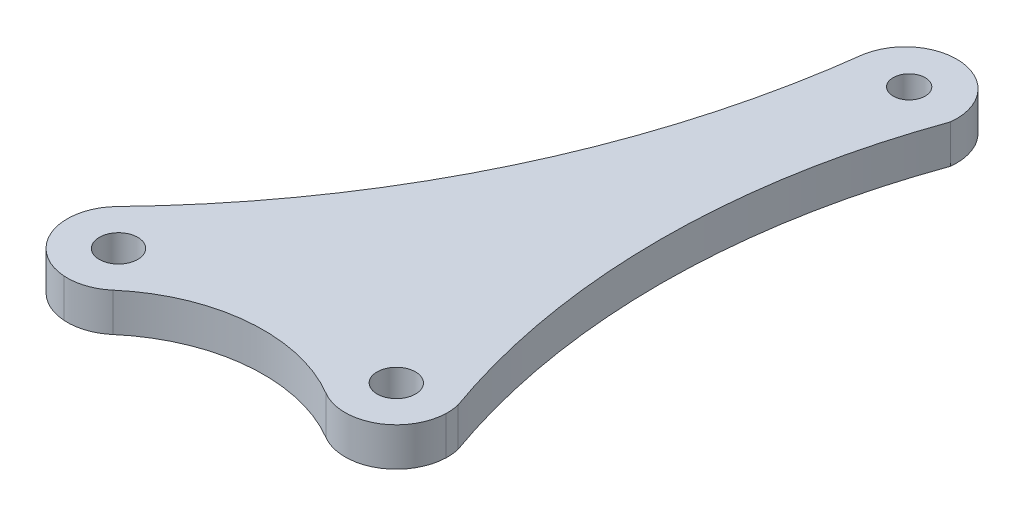
ISO-10303-21;
HEADER;
FILE_DESCRIPTION(('STEP AP214'),'2;1');
FILE_NAME('part.step','',(''),(''),'','','');
FILE_SCHEMA(('AUTOMOTIVE_DESIGN { 1 0 10303 214 1 1 1 1 }'));
ENDSEC;
DATA;
#1=APPLICATION_CONTEXT('core data for automotive mechanical design processes');
#2=APPLICATION_PROTOCOL_DEFINITION('international standard','automotive_design',2000,#1);
#3=PRODUCT_CONTEXT('',#1,'mechanical');
#4=PRODUCT('Part','Part','',(#3));
#5=PRODUCT_RELATED_PRODUCT_CATEGORY('part','',(#4));
#6=PRODUCT_DEFINITION_FORMATION('','',#4);
#7=PRODUCT_DEFINITION_CONTEXT('part definition',#1,'design');
#8=PRODUCT_DEFINITION('design','',#6,#7);
#9=PRODUCT_DEFINITION_SHAPE('','',#8);
#10=(LENGTH_UNIT() NAMED_UNIT(*) SI_UNIT(.MILLI.,.METRE.));
#11=(NAMED_UNIT(*) PLANE_ANGLE_UNIT() SI_UNIT($,.RADIAN.));
#12=(NAMED_UNIT(*) SI_UNIT($,.STERADIAN.) SOLID_ANGLE_UNIT());
#13=UNCERTAINTY_MEASURE_WITH_UNIT(LENGTH_MEASURE(1.E-05),#10,'distance_accuracy_value','');
#14=(GEOMETRIC_REPRESENTATION_CONTEXT(3) GLOBAL_UNCERTAINTY_ASSIGNED_CONTEXT((#13)) GLOBAL_UNIT_ASSIGNED_CONTEXT((#10,
#11,#12)) REPRESENTATION_CONTEXT('',''));
#15=CARTESIAN_POINT('',(0.,0.,0.));
#16=DIRECTION('',(0.,0.,1.));
#17=DIRECTION('',(1.,0.,0.));
#18=AXIS2_PLACEMENT_3D('',#15,#16,#17);
#19=CARTESIAN_POINT('',(27.9997395925462,3.,-100.003328656912));
#20=DIRECTION('',(0.,1.,0.));
#21=DIRECTION('',(0.,0.,1.));
#22=AXIS2_PLACEMENT_3D('',#19,#20,#21);
#23=PLANE('',#22);
#24=CARTESIAN_POINT('',(27.9995484159629,3.,-100.00220000214));
#25=DIRECTION('',(0.,1.,0.));
#26=DIRECTION('',(0.,0.,1.));
#27=AXIS2_PLACEMENT_3D('',#24,#25,#26);
#28=CIRCLE('',#27,1.5);
#29=CARTESIAN_POINT('',(27.9995484159629,3.,-98.5022000021398));
#30=VERTEX_POINT('',#29);
#31=EDGE_CURVE('E181',#30,#30,#28,.T.);
#32=ORIENTED_EDGE('',*,*,#31,.F.);
#33=EDGE_LOOP('',(#32));
#34=FACE_BOUND('',#33,.T.);
#35=CARTESIAN_POINT('',(27.9999307691296,3.,-100.004457311684));
#36=DIRECTION('',(0.,1.,0.));
#37=DIRECTION('',(0.,0.,1.));
#38=AXIS2_PLACEMENT_3D('',#35,#36,#37);
#39=CIRCLE('',#38,4.00207966259629);
#40=CARTESIAN_POINT('',(25.9594409642448,3.,-96.5616324567239));
#41=VERTEX_POINT('',#40);
#42=CARTESIAN_POINT('',(32.000304550885,3.,-99.8876188248278));
#43=VERTEX_POINT('',#42);
#44=EDGE_CURVE('E144',#41,#43,#39,.T.);
#45=ORIENTED_EDGE('',*,*,#44,.T.);
#46=CARTESIAN_POINT('',(27.9995484159629,3.,-100.00220000214));
#47=DIRECTION('',(0.,1.,0.));
#48=DIRECTION('',(0.,0.,1.));
#49=AXIS2_PLACEMENT_3D('',#46,#47,#48);
#50=CIRCLE('',#49,4.00239659420592);
#51=CARTESIAN_POINT('',(31.8998593501814,3.,-100.900394365141));
#52=VERTEX_POINT('',#51);
#53=EDGE_CURVE('E92',#43,#52,#50,.T.);
#54=ORIENTED_EDGE('',*,*,#53,.T.);
#55=CARTESIAN_POINT('',(85.362032945457,3.,-119.967387334482));
#56=DIRECTION('',(0.,-1.,0.));
#57=DIRECTION('',(0.,0.,1.));
#58=AXIS2_PLACEMENT_3D('',#55,#56,#57);
#59=CIRCLE('',#58,56.7604988211369);
#60=CARTESIAN_POINT('',(31.9728070759718,3.,-139.2376957773));
#61=VERTEX_POINT('',#60);
#62=EDGE_CURVE('E159',#52,#61,#59,.T.);
#63=ORIENTED_EDGE('',*,*,#62,.T.);
#64=CARTESIAN_POINT('',(27.976753798876,3.,-139.709113533065));
#65=DIRECTION('',(0.,1.,0.));
#66=DIRECTION('',(0.,0.,1.));
#67=AXIS2_PLACEMENT_3D('',#64,#65,#66);
#68=CIRCLE('',#67,4.02376397094048);
#69=CARTESIAN_POINT('',(24.0296582334114,3.,-140.490850759331));
#70=VERTEX_POINT('',#69);
#71=EDGE_CURVE('E172',#61,#70,#68,.T.);
#72=ORIENTED_EDGE('',*,*,#71,.T.);
#73=CARTESIAN_POINT('',(-44.3435391340725,3.,-148.905424388532));
#74=DIRECTION('',(0.,-1.,0.));
#75=DIRECTION('',(0.,0.,1.));
#76=AXIS2_PLACEMENT_3D('',#73,#74,#75);
#77=CIRCLE('',#76,68.8890351769726);
#78=CARTESIAN_POINT('',(5.19929151411349,3.,-101.038869269333));
#79=VERTEX_POINT('',#78);
#80=EDGE_CURVE('E111',#70,#79,#77,.T.);
#81=ORIENTED_EDGE('',*,*,#80,.T.);
#82=CARTESIAN_POINT('',(8.07557004138567,3.,-98.2591810851337));
#83=DIRECTION('',(0.,1.,0.));
#84=DIRECTION('',(0.,0.,1.));
#85=AXIS2_PLACEMENT_3D('',#82,#83,#84);
#86=CIRCLE('',#85,3.99995557073113);
#87=CARTESIAN_POINT('',(7.82466408204698,3.,-94.2671025829758));
#88=VERTEX_POINT('',#87);
#89=EDGE_CURVE('E105',#79,#88,#86,.T.);
#90=ORIENTED_EDGE('',*,*,#89,.T.);
#91=CARTESIAN_POINT('',(8.07563789305204,3.,-98.2592435633386));
#92=DIRECTION('',(0.,1.,0.));
#93=DIRECTION('',(0.,0.,1.));
#94=AXIS2_PLACEMENT_3D('',#91,#92,#93);
#95=CIRCLE('',#94,4.00002218255128);
#96=CARTESIAN_POINT('',(10.6820969431933,3.,-95.2250140596855));
#97=VERTEX_POINT('',#96);
#98=EDGE_CURVE('E109',#88,#97,#95,.T.);
#99=ORIENTED_EDGE('',*,*,#98,.T.);
#100=CARTESIAN_POINT('',(19.2520313653719,3.,-85.2491362051027));
#101=DIRECTION('',(0.,-1.,0.));
#102=DIRECTION('',(0.,0.,1.));
#103=AXIS2_PLACEMENT_3D('',#100,#101,#102);
#104=CIRCLE('',#103,13.1514985826709);
#105=EDGE_CURVE('E49',#97,#41,#104,.T.);
#106=ORIENTED_EDGE('',*,*,#105,.T.);
#107=EDGE_LOOP('',(#45,#54,#63,#72,#81,#90,#99,#106));
#108=FACE_BOUND('',#107,.T.);
#109=CARTESIAN_POINT('',(8.07561116786087,3.,-98.2592968022569));
#110=DIRECTION('',(0.,1.,0.));
#111=DIRECTION('',(0.,0.,1.));
#112=AXIS2_PLACEMENT_3D('',#109,#110,#111);
#113=CIRCLE('',#112,1.5);
#114=CARTESIAN_POINT('',(8.07561116786087,3.,-96.7592968022569));
#115=VERTEX_POINT('',#114);
#116=EDGE_CURVE('E133',#115,#115,#113,.T.);
#117=ORIENTED_EDGE('',*,*,#116,.F.);
#118=EDGE_LOOP('',(#117));
#119=FACE_BOUND('',#118,.T.);
#120=CARTESIAN_POINT('',(27.9996711600126,3.,-140.00224351471));
#121=DIRECTION('',(0.,1.,0.));
#122=DIRECTION('',(0.,0.,1.));
#123=AXIS2_PLACEMENT_3D('',#120,#121,#122);
#124=CIRCLE('',#123,1.25);
#125=CARTESIAN_POINT('',(27.9996711600126,3.,-138.75224351471));
#126=VERTEX_POINT('',#125);
#127=EDGE_CURVE('E187',#126,#126,#124,.T.);
#128=ORIENTED_EDGE('',*,*,#127,.F.);
#129=EDGE_LOOP('',(#128));
#130=FACE_BOUND('',#129,.T.);
#131=ADVANCED_FACE('F32',(#34,#108,#119,#130),#23,.T.);
#132=CARTESIAN_POINT('',(27.9997395925462,0.,-100.003328656912));
#133=DIRECTION('',(0.,1.,0.));
#134=DIRECTION('',(0.,0.,1.));
#135=AXIS2_PLACEMENT_3D('',#132,#133,#134);
#136=PLANE('',#135);
#137=CARTESIAN_POINT('',(27.9999307691296,0.,-100.004457311684));
#138=DIRECTION('',(0.,1.,0.));
#139=DIRECTION('',(0.,0.,1.));
#140=AXIS2_PLACEMENT_3D('',#137,#138,#139);
#141=CIRCLE('',#140,4.00207966259629);
#142=CARTESIAN_POINT('',(25.9594409642448,0.,-96.5616324567239));
#143=VERTEX_POINT('',#142);
#144=CARTESIAN_POINT('',(32.000304550885,0.,-99.8876188248278));
#145=VERTEX_POINT('',#144);
#146=EDGE_CURVE('E129',#143,#145,#141,.T.);
#147=ORIENTED_EDGE('',*,*,#146,.F.);
#148=CARTESIAN_POINT('',(19.2520313653719,0.,-85.2491362051027));
#149=DIRECTION('',(0.,-1.,0.));
#150=DIRECTION('',(0.,0.,1.));
#151=AXIS2_PLACEMENT_3D('',#148,#149,#150);
#152=CIRCLE('',#151,13.1514985826709);
#153=CARTESIAN_POINT('',(10.6820969431933,0.,-95.2250140596855));
#154=VERTEX_POINT('',#153);
#155=EDGE_CURVE('E84',#154,#143,#152,.T.);
#156=ORIENTED_EDGE('',*,*,#155,.F.);
#157=CARTESIAN_POINT('',(8.07563789305204,0.,-98.2592435633386));
#158=DIRECTION('',(0.,1.,0.));
#159=DIRECTION('',(0.,0.,1.));
#160=AXIS2_PLACEMENT_3D('',#157,#158,#159);
#161=CIRCLE('',#160,4.00002218255128);
#162=CARTESIAN_POINT('',(7.82466408204698,0.,-94.2671025829758));
#163=VERTEX_POINT('',#162);
#164=EDGE_CURVE('E78',#163,#154,#161,.T.);
#165=ORIENTED_EDGE('',*,*,#164,.F.);
#166=CARTESIAN_POINT('',(8.07557004138567,0.,-98.2591810851337));
#167=DIRECTION('',(0.,1.,0.));
#168=DIRECTION('',(0.,0.,1.));
#169=AXIS2_PLACEMENT_3D('',#166,#167,#168);
#170=CIRCLE('',#169,3.99995557073113);
#171=CARTESIAN_POINT('',(5.19929151411349,0.,-101.038869269333));
#172=VERTEX_POINT('',#171);
#173=EDGE_CURVE('E119',#172,#163,#170,.T.);
#174=ORIENTED_EDGE('',*,*,#173,.F.);
#175=CARTESIAN_POINT('',(-44.3435391340725,0.,-148.905424388532));
#176=DIRECTION('',(0.,-1.,0.));
#177=DIRECTION('',(0.,0.,1.));
#178=AXIS2_PLACEMENT_3D('',#175,#176,#177);
#179=CIRCLE('',#178,68.8890351769726);
#180=CARTESIAN_POINT('',(24.0296582334114,0.,-140.490850759331));
#181=VERTEX_POINT('',#180);
#182=EDGE_CURVE('E139',#181,#172,#179,.T.);
#183=ORIENTED_EDGE('',*,*,#182,.F.);
#184=CARTESIAN_POINT('',(27.976753798876,0.,-139.709113533065));
#185=DIRECTION('',(0.,1.,0.));
#186=DIRECTION('',(0.,0.,1.));
#187=AXIS2_PLACEMENT_3D('',#184,#185,#186);
#188=CIRCLE('',#187,4.02376397094048);
#189=CARTESIAN_POINT('',(31.9728070759718,0.,-139.2376957773));
#190=VERTEX_POINT('',#189);
#191=EDGE_CURVE('E137',#190,#181,#188,.T.);
#192=ORIENTED_EDGE('',*,*,#191,.F.);
#193=CARTESIAN_POINT('',(85.362032945457,0.,-119.967387334482));
#194=DIRECTION('',(0.,-1.,0.));
#195=DIRECTION('',(0.,0.,1.));
#196=AXIS2_PLACEMENT_3D('',#193,#194,#195);
#197=CIRCLE('',#196,56.7604988211369);
#198=CARTESIAN_POINT('',(31.8998593501814,0.,-100.900394365141));
#199=VERTEX_POINT('',#198);
#200=EDGE_CURVE('E135',#199,#190,#197,.T.);
#201=ORIENTED_EDGE('',*,*,#200,.F.);
#202=CARTESIAN_POINT('',(27.9995484159629,0.,-100.00220000214));
#203=DIRECTION('',(0.,1.,0.));
#204=DIRECTION('',(0.,0.,1.));
#205=AXIS2_PLACEMENT_3D('',#202,#203,#204);
#206=CIRCLE('',#205,4.00239659420592);
#207=EDGE_CURVE('E132',#145,#199,#206,.T.);
#208=ORIENTED_EDGE('',*,*,#207,.F.);
#209=EDGE_LOOP('',(#147,#156,#165,#174,#183,#192,#201,#208));
#210=FACE_BOUND('',#209,.T.);
#211=CARTESIAN_POINT('',(8.07561116786087,0.,-98.2592968022569));
#212=DIRECTION('',(0.,1.,0.));
#213=DIRECTION('',(0.,0.,1.));
#214=AXIS2_PLACEMENT_3D('',#211,#212,#213);
#215=CIRCLE('',#214,1.5);
#216=CARTESIAN_POINT('',(8.07561116786087,0.,-96.7592968022569));
#217=VERTEX_POINT('',#216);
#218=EDGE_CURVE('E178',#217,#217,#215,.T.);
#219=ORIENTED_EDGE('',*,*,#218,.T.);
#220=EDGE_LOOP('',(#219));
#221=FACE_BOUND('',#220,.T.);
#222=CARTESIAN_POINT('',(27.9995484159629,0.,-100.00220000214));
#223=DIRECTION('',(0.,1.,0.));
#224=DIRECTION('',(0.,0.,1.));
#225=AXIS2_PLACEMENT_3D('',#222,#223,#224);
#226=CIRCLE('',#225,1.5);
#227=CARTESIAN_POINT('',(27.9995484159629,0.,-98.5022000021398));
#228=VERTEX_POINT('',#227);
#229=EDGE_CURVE('E184',#228,#228,#226,.T.);
#230=ORIENTED_EDGE('',*,*,#229,.T.);
#231=EDGE_LOOP('',(#230));
#232=FACE_BOUND('',#231,.T.);
#233=CARTESIAN_POINT('',(27.9996711600126,0.,-140.00224351471));
#234=DIRECTION('',(0.,1.,0.));
#235=DIRECTION('',(0.,0.,1.));
#236=AXIS2_PLACEMENT_3D('',#233,#234,#235);
#237=CIRCLE('',#236,1.25);
#238=CARTESIAN_POINT('',(27.9996711600126,0.,-138.75224351471));
#239=VERTEX_POINT('',#238);
#240=EDGE_CURVE('E190',#239,#239,#237,.T.);
#241=ORIENTED_EDGE('',*,*,#240,.T.);
#242=EDGE_LOOP('',(#241));
#243=FACE_BOUND('',#242,.T.);
#244=ADVANCED_FACE('F163',(#210,#221,#232,#243),#136,.F.);
#245=CARTESIAN_POINT('',(27.9999307691296,3.,-100.004457311684));
#246=DIRECTION('',(0.,-1.,0.));
#247=DIRECTION('',(0.,0.,-1.));
#248=AXIS2_PLACEMENT_3D('',#245,#246,#247);
#249=CYLINDRICAL_SURFACE('',#248,4.00207966259629);
#250=ORIENTED_EDGE('',*,*,#146,.T.);
#251=DIRECTION('',(0.,-1.,0.));
#252=VECTOR('',#251,1.);
#253=CARTESIAN_POINT('',(32.000304550885,3.,-99.8876188248278));
#254=LINE('',#253,#252);
#255=EDGE_CURVE('E11',#43,#145,#254,.T.);
#256=ORIENTED_EDGE('',*,*,#255,.F.);
#257=ORIENTED_EDGE('',*,*,#44,.F.);
#258=DIRECTION('',(0.,-1.,0.));
#259=VECTOR('',#258,1.);
#260=CARTESIAN_POINT('',(25.9594409642448,3.,-96.5616324567239));
#261=LINE('',#260,#259);
#262=EDGE_CURVE('E125',#41,#143,#261,.T.);
#263=ORIENTED_EDGE('',*,*,#262,.T.);
#264=EDGE_LOOP('',(#250,#256,#257,#263));
#265=FACE_BOUND('',#264,.T.);
#266=ADVANCED_FACE('F34',(#265),#249,.T.);
#267=CARTESIAN_POINT('',(27.9995484159629,3.,-100.00220000214));
#268=DIRECTION('',(0.,-1.,0.));
#269=DIRECTION('',(0.,0.,-1.));
#270=AXIS2_PLACEMENT_3D('',#267,#268,#269);
#271=CYLINDRICAL_SURFACE('',#270,4.00239659420592);
#272=ORIENTED_EDGE('',*,*,#207,.T.);
#273=DIRECTION('',(0.,-1.,0.));
#274=VECTOR('',#273,1.);
#275=CARTESIAN_POINT('',(31.8998593501814,3.,-100.900394365141));
#276=LINE('',#275,#274);
#277=EDGE_CURVE('E41',#52,#199,#276,.T.);
#278=ORIENTED_EDGE('',*,*,#277,.F.);
#279=ORIENTED_EDGE('',*,*,#53,.F.);
#280=ORIENTED_EDGE('',*,*,#255,.T.);
#281=EDGE_LOOP('',(#272,#278,#279,#280));
#282=FACE_BOUND('',#281,.T.);
#283=ADVANCED_FACE('F223',(#282),#271,.T.);
#284=CARTESIAN_POINT('',(85.362032945457,3.,-119.967387334482));
#285=DIRECTION('',(0.,-1.,0.));
#286=DIRECTION('',(0.,0.,-1.));
#287=AXIS2_PLACEMENT_3D('',#284,#285,#286);
#288=CYLINDRICAL_SURFACE('',#287,56.7604988211369);
#289=ORIENTED_EDGE('',*,*,#200,.T.);
#290=DIRECTION('',(0.,-1.,0.));
#291=VECTOR('',#290,1.);
#292=CARTESIAN_POINT('',(31.9728070759718,3.,-139.2376957773));
#293=LINE('',#292,#291);
#294=EDGE_CURVE('E151',#61,#190,#293,.T.);
#295=ORIENTED_EDGE('',*,*,#294,.F.);
#296=ORIENTED_EDGE('',*,*,#62,.F.);
#297=ORIENTED_EDGE('',*,*,#277,.T.);
#298=EDGE_LOOP('',(#289,#295,#296,#297));
#299=FACE_BOUND('',#298,.T.);
#300=ADVANCED_FACE('F157',(#299),#288,.F.);
#301=CARTESIAN_POINT('',(27.976753798876,3.,-139.709113533065));
#302=DIRECTION('',(0.,-1.,0.));
#303=DIRECTION('',(0.,0.,-1.));
#304=AXIS2_PLACEMENT_3D('',#301,#302,#303);
#305=CYLINDRICAL_SURFACE('',#304,4.02376397094048);
#306=ORIENTED_EDGE('',*,*,#191,.T.);
#307=DIRECTION('',(0.,-1.,0.));
#308=VECTOR('',#307,1.);
#309=CARTESIAN_POINT('',(24.0296582334114,3.,-140.490850759331));
#310=LINE('',#309,#308);
#311=EDGE_CURVE('E148',#70,#181,#310,.T.);
#312=ORIENTED_EDGE('',*,*,#311,.F.);
#313=ORIENTED_EDGE('',*,*,#71,.F.);
#314=ORIENTED_EDGE('',*,*,#294,.T.);
#315=EDGE_LOOP('',(#306,#312,#313,#314));
#316=FACE_BOUND('',#315,.T.);
#317=ADVANCED_FACE('F168',(#316),#305,.T.);
#318=CARTESIAN_POINT('',(-44.3435391340725,3.,-148.905424388532));
#319=DIRECTION('',(0.,-1.,0.));
#320=DIRECTION('',(0.,0.,-1.));
#321=AXIS2_PLACEMENT_3D('',#318,#319,#320);
#322=CYLINDRICAL_SURFACE('',#321,68.8890351769726);
#323=ORIENTED_EDGE('',*,*,#182,.T.);
#324=DIRECTION('',(0.,-1.,0.));
#325=VECTOR('',#324,1.);
#326=CARTESIAN_POINT('',(5.19929151411349,3.,-101.038869269333));
#327=LINE('',#326,#325);
#328=EDGE_CURVE('E120',#79,#172,#327,.T.);
#329=ORIENTED_EDGE('',*,*,#328,.F.);
#330=ORIENTED_EDGE('',*,*,#80,.F.);
#331=ORIENTED_EDGE('',*,*,#311,.T.);
#332=EDGE_LOOP('',(#323,#329,#330,#331));
#333=FACE_BOUND('',#332,.T.);
#334=ADVANCED_FACE('F171',(#333),#322,.F.);
#335=CARTESIAN_POINT('',(8.07557004138567,3.,-98.2591810851337));
#336=DIRECTION('',(0.,-1.,0.));
#337=DIRECTION('',(0.,0.,-1.));
#338=AXIS2_PLACEMENT_3D('',#335,#336,#337);
#339=CYLINDRICAL_SURFACE('',#338,3.99995557073113);
#340=ORIENTED_EDGE('',*,*,#173,.T.);
#341=DIRECTION('',(0.,-1.,0.));
#342=VECTOR('',#341,1.);
#343=CARTESIAN_POINT('',(7.82466408204698,3.,-94.2671025829758));
#344=LINE('',#343,#342);
#345=EDGE_CURVE('E116',#88,#163,#344,.T.);
#346=ORIENTED_EDGE('',*,*,#345,.F.);
#347=ORIENTED_EDGE('',*,*,#89,.F.);
#348=ORIENTED_EDGE('',*,*,#328,.T.);
#349=EDGE_LOOP('',(#340,#346,#347,#348));
#350=FACE_BOUND('',#349,.T.);
#351=ADVANCED_FACE('F117',(#350),#339,.T.);
#352=CARTESIAN_POINT('',(8.07563789305204,3.,-98.2592435633386));
#353=DIRECTION('',(0.,-1.,0.));
#354=DIRECTION('',(0.,0.,-1.));
#355=AXIS2_PLACEMENT_3D('',#352,#353,#354);
#356=CYLINDRICAL_SURFACE('',#355,4.00002218255128);
#357=ORIENTED_EDGE('',*,*,#164,.T.);
#358=DIRECTION('',(0.,-1.,0.));
#359=VECTOR('',#358,1.);
#360=CARTESIAN_POINT('',(10.6820969431933,3.,-95.2250140596855));
#361=LINE('',#360,#359);
#362=EDGE_CURVE('E121',#97,#154,#361,.T.);
#363=ORIENTED_EDGE('',*,*,#362,.F.);
#364=ORIENTED_EDGE('',*,*,#98,.F.);
#365=ORIENTED_EDGE('',*,*,#345,.T.);
#366=EDGE_LOOP('',(#357,#363,#364,#365));
#367=FACE_BOUND('',#366,.T.);
#368=ADVANCED_FACE('F123',(#367),#356,.T.);
#369=CARTESIAN_POINT('',(19.2520313653719,3.,-85.2491362051027));
#370=DIRECTION('',(0.,-1.,0.));
#371=DIRECTION('',(0.,0.,-1.));
#372=AXIS2_PLACEMENT_3D('',#369,#370,#371);
#373=CYLINDRICAL_SURFACE('',#372,13.1514985826709);
#374=ORIENTED_EDGE('',*,*,#155,.T.);
#375=ORIENTED_EDGE('',*,*,#262,.F.);
#376=ORIENTED_EDGE('',*,*,#105,.F.);
#377=ORIENTED_EDGE('',*,*,#362,.T.);
#378=EDGE_LOOP('',(#374,#375,#376,#377));
#379=FACE_BOUND('',#378,.T.);
#380=ADVANCED_FACE('F211',(#379),#373,.F.);
#381=CARTESIAN_POINT('',(8.07561116786087,3.,-98.2592968022569));
#382=DIRECTION('',(0.,-1.,0.));
#383=DIRECTION('',(0.,0.,-1.));
#384=AXIS2_PLACEMENT_3D('',#381,#382,#383);
#385=CYLINDRICAL_SURFACE('',#384,1.5);
#386=ORIENTED_EDGE('',*,*,#116,.T.);
#387=EDGE_LOOP('',(#386));
#388=FACE_BOUND('',#387,.T.);
#389=ORIENTED_EDGE('',*,*,#218,.F.);
#390=EDGE_LOOP('',(#389));
#391=FACE_BOUND('',#390,.T.);
#392=ADVANCED_FACE('F208',(#388,#391),#385,.F.);
#393=CARTESIAN_POINT('',(27.9995484159629,3.,-100.00220000214));
#394=DIRECTION('',(0.,-1.,0.));
#395=DIRECTION('',(0.,0.,-1.));
#396=AXIS2_PLACEMENT_3D('',#393,#394,#395);
#397=CYLINDRICAL_SURFACE('',#396,1.5);
#398=ORIENTED_EDGE('',*,*,#31,.T.);
#399=EDGE_LOOP('',(#398));
#400=FACE_BOUND('',#399,.T.);
#401=ORIENTED_EDGE('',*,*,#229,.F.);
#402=EDGE_LOOP('',(#401));
#403=FACE_BOUND('',#402,.T.);
#404=ADVANCED_FACE('F287',(#400,#403),#397,.F.);
#405=CARTESIAN_POINT('',(27.9996711600126,3.,-140.00224351471));
#406=DIRECTION('',(0.,-1.,0.));
#407=DIRECTION('',(0.,0.,-1.));
#408=AXIS2_PLACEMENT_3D('',#405,#406,#407);
#409=CYLINDRICAL_SURFACE('',#408,1.25);
#410=ORIENTED_EDGE('',*,*,#127,.T.);
#411=EDGE_LOOP('',(#410));
#412=FACE_BOUND('',#411,.T.);
#413=ORIENTED_EDGE('',*,*,#240,.F.);
#414=EDGE_LOOP('',(#413));
#415=FACE_BOUND('',#414,.T.);
#416=ADVANCED_FACE('F196',(#412,#415),#409,.F.);
#417=CLOSED_SHELL('',(#131,#244,#266,#283,#300,#317,#334,#351,#368,#380,#392,#404,#416));
#418=MANIFOLD_SOLID_BREP('B2',#417);
#419=ADVANCED_BREP_SHAPE_REPRESENTATION('',(#18,#418),#14);
#420=SHAPE_DEFINITION_REPRESENTATION(#9,#419);
ENDSEC;
END-ISO-10303-21;
